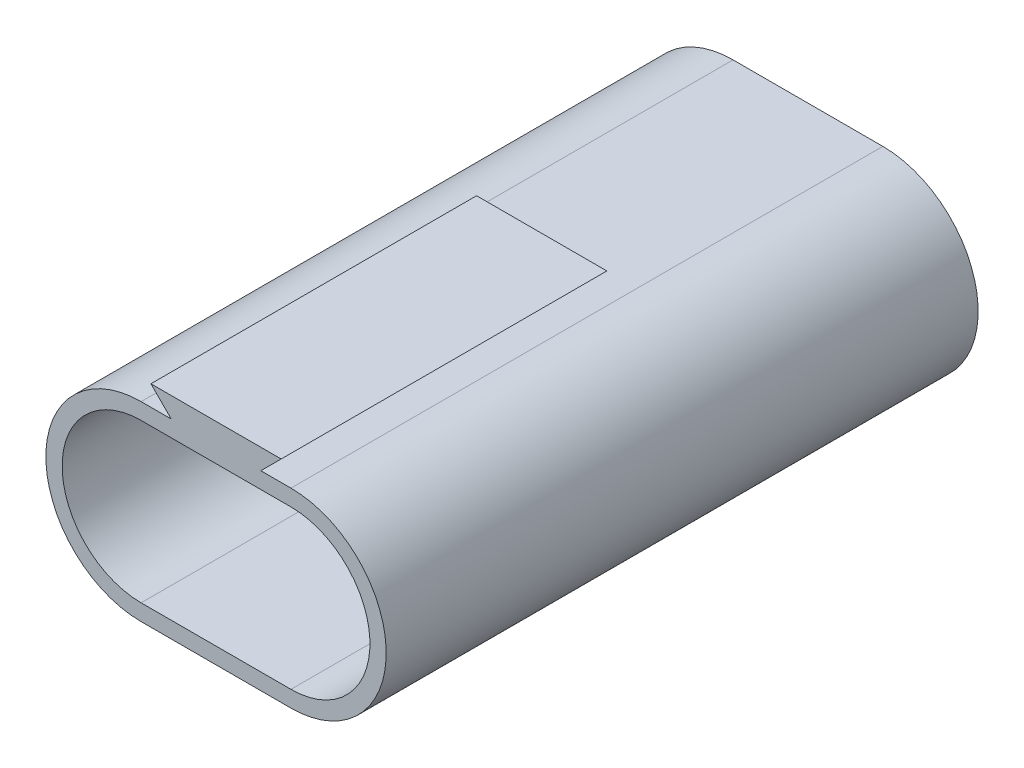
ISO-10303-21;
HEADER;
FILE_DESCRIPTION(('STEP AP214'),'2;1');
FILE_NAME('part.step','',(''),(''),'','','');
FILE_SCHEMA(('AUTOMOTIVE_DESIGN { 1 0 10303 214 1 1 1 1 }'));
ENDSEC;
DATA;
#1=APPLICATION_CONTEXT('core data for automotive mechanical design processes');
#2=APPLICATION_PROTOCOL_DEFINITION('international standard','automotive_design',2000,#1);
#3=PRODUCT_CONTEXT('',#1,'mechanical');
#4=PRODUCT('Part','Part','',(#3));
#5=PRODUCT_RELATED_PRODUCT_CATEGORY('part','',(#4));
#6=PRODUCT_DEFINITION_FORMATION('','',#4);
#7=PRODUCT_DEFINITION_CONTEXT('part definition',#1,'design');
#8=PRODUCT_DEFINITION('design','',#6,#7);
#9=PRODUCT_DEFINITION_SHAPE('','',#8);
#10=(LENGTH_UNIT() NAMED_UNIT(*) SI_UNIT(.MILLI.,.METRE.));
#11=(NAMED_UNIT(*) PLANE_ANGLE_UNIT() SI_UNIT($,.RADIAN.));
#12=(NAMED_UNIT(*) SI_UNIT($,.STERADIAN.) SOLID_ANGLE_UNIT());
#13=UNCERTAINTY_MEASURE_WITH_UNIT(LENGTH_MEASURE(1.E-05),#10,'distance_accuracy_value','');
#14=(GEOMETRIC_REPRESENTATION_CONTEXT(3) GLOBAL_UNCERTAINTY_ASSIGNED_CONTEXT((#13)) GLOBAL_UNIT_ASSIGNED_CONTEXT((#10,
#11,#12)) REPRESENTATION_CONTEXT('',''));
#15=CARTESIAN_POINT('',(0.,0.,0.));
#16=DIRECTION('',(0.,0.,1.));
#17=DIRECTION('',(1.,0.,0.));
#18=AXIS2_PLACEMENT_3D('',#15,#16,#17);
#19=CARTESIAN_POINT('',(0.,11.7,70.2));
#20=DIRECTION('',(0.,1.,0.));
#21=DIRECTION('',(0.,0.,1.));
#22=AXIS2_PLACEMENT_3D('',#19,#20,#21);
#23=PLANE('',#22);
#24=DIRECTION('',(1.,0.,0.));
#25=VECTOR('',#24,1.);
#26=CARTESIAN_POINT('',(0.,11.7,27.7));
#27=LINE('',#26,#25);
#28=CARTESIAN_POINT('',(3.7,11.7,27.7));
#29=VERTEX_POINT('',#28);
#30=CARTESIAN_POINT('',(14.7,11.7,27.7));
#31=VERTEX_POINT('',#30);
#32=EDGE_CURVE('E313',#29,#31,#27,.T.);
#33=ORIENTED_EDGE('',*,*,#32,.T.);
#34=DIRECTION('',(0.,0.,1.));
#35=VECTOR('',#34,1.);
#36=CARTESIAN_POINT('',(14.7,11.7,30.2));
#37=LINE('',#36,#35);
#38=CARTESIAN_POINT('',(14.7,11.7,70.2));
#39=VERTEX_POINT('',#38);
#40=EDGE_CURVE('E233',#31,#39,#37,.T.);
#41=ORIENTED_EDGE('',*,*,#40,.T.);
#42=DIRECTION('',(1.,0.,0.));
#43=VECTOR('',#42,1.);
#44=CARTESIAN_POINT('',(0.,11.7,70.2));
#45=LINE('',#44,#43);
#46=CARTESIAN_POINT('',(18.4,11.7,70.2));
#47=VERTEX_POINT('',#46);
#48=EDGE_CURVE('E272',#39,#47,#45,.T.);
#49=ORIENTED_EDGE('',*,*,#48,.T.);
#50=DIRECTION('',(0.,0.,-1.));
#51=VECTOR('',#50,1.);
#52=CARTESIAN_POINT('',(18.4,11.7,70.2));
#53=LINE('',#52,#51);
#54=CARTESIAN_POINT('',(18.4,11.7,-2.5));
#55=VERTEX_POINT('',#54);
#56=EDGE_CURVE('E300',#47,#55,#53,.T.);
#57=ORIENTED_EDGE('',*,*,#56,.T.);
#58=DIRECTION('',(1.,0.,0.));
#59=VECTOR('',#58,1.);
#60=CARTESIAN_POINT('',(0.,11.7,-2.5));
#61=LINE('',#60,#59);
#62=CARTESIAN_POINT('',(0.,11.7,-2.5));
#63=VERTEX_POINT('',#62);
#64=EDGE_CURVE('E243',#63,#55,#61,.T.);
#65=ORIENTED_EDGE('',*,*,#64,.F.);
#66=DIRECTION('',(0.,0.,-1.));
#67=VECTOR('',#66,1.);
#68=CARTESIAN_POINT('',(0.,11.7,70.2));
#69=LINE('',#68,#67);
#70=CARTESIAN_POINT('',(0.,11.7,70.2));
#71=VERTEX_POINT('',#70);
#72=EDGE_CURVE('E310',#71,#63,#69,.T.);
#73=ORIENTED_EDGE('',*,*,#72,.F.);
#74=CARTESIAN_POINT('',(3.7,11.7,70.2));
#75=VERTEX_POINT('',#74);
#76=EDGE_CURVE('E273',#71,#75,#45,.T.);
#77=ORIENTED_EDGE('',*,*,#76,.T.);
#78=DIRECTION('',(0.,0.,1.));
#79=VECTOR('',#78,1.);
#80=CARTESIAN_POINT('',(3.7,11.7,30.2));
#81=LINE('',#80,#79);
#82=EDGE_CURVE('E214',#29,#75,#81,.T.);
#83=ORIENTED_EDGE('',*,*,#82,.F.);
#84=EDGE_LOOP('',(#33,#41,#49,#57,#65,#73,#77,#83));
#85=FACE_BOUND('',#84,.T.);
#86=ADVANCED_FACE('F46',(#85),#23,.T.);
#87=CARTESIAN_POINT('',(0.,0.,70.2));
#88=DIRECTION('',(0.,0.,-1.));
#89=DIRECTION('',(-1.,0.,0.));
#90=AXIS2_PLACEMENT_3D('',#87,#88,#89);
#91=CYLINDRICAL_SURFACE('',#90,11.7);
#92=ORIENTED_EDGE('',*,*,#72,.T.);
#93=CARTESIAN_POINT('',(0.,0.,-2.5));
#94=DIRECTION('',(0.,0.,-1.));
#95=DIRECTION('',(-1.,0.,0.));
#96=AXIS2_PLACEMENT_3D('',#93,#94,#95);
#97=CIRCLE('',#96,11.7);
#98=CARTESIAN_POINT('',(0.,-11.7,-2.5));
#99=VERTEX_POINT('',#98);
#100=EDGE_CURVE('E229',#99,#63,#97,.T.);
#101=ORIENTED_EDGE('',*,*,#100,.F.);
#102=DIRECTION('',(0.,0.,-1.));
#103=VECTOR('',#102,1.);
#104=CARTESIAN_POINT('',(0.,-11.7,70.2));
#105=LINE('',#104,#103);
#106=CARTESIAN_POINT('',(0.,-11.7,70.2));
#107=VERTEX_POINT('',#106);
#108=EDGE_CURVE('E307',#107,#99,#105,.T.);
#109=ORIENTED_EDGE('',*,*,#108,.F.);
#110=CARTESIAN_POINT('',(0.,0.,70.2));
#111=DIRECTION('',(0.,0.,1.));
#112=DIRECTION('',(1.,0.,0.));
#113=AXIS2_PLACEMENT_3D('',#110,#111,#112);
#114=CIRCLE('',#113,11.7);
#115=EDGE_CURVE('E276',#71,#107,#114,.T.);
#116=ORIENTED_EDGE('',*,*,#115,.F.);
#117=EDGE_LOOP('',(#92,#101,#109,#116));
#118=FACE_BOUND('',#117,.T.);
#119=ADVANCED_FACE('F358',(#118),#91,.T.);
#120=CARTESIAN_POINT('',(0.,-11.7,70.2));
#121=DIRECTION('',(0.,1.,0.));
#122=DIRECTION('',(0.,0.,1.));
#123=AXIS2_PLACEMENT_3D('',#120,#121,#122);
#124=PLANE('',#123);
#125=ORIENTED_EDGE('',*,*,#108,.T.);
#126=DIRECTION('',(-1.,0.,0.));
#127=VECTOR('',#126,1.);
#128=CARTESIAN_POINT('',(18.4,-11.7,-2.5));
#129=LINE('',#128,#127);
#130=CARTESIAN_POINT('',(18.4,-11.7,-2.5));
#131=VERTEX_POINT('',#130);
#132=EDGE_CURVE('E251',#131,#99,#129,.T.);
#133=ORIENTED_EDGE('',*,*,#132,.F.);
#134=DIRECTION('',(0.,0.,-1.));
#135=VECTOR('',#134,1.);
#136=CARTESIAN_POINT('',(18.4,-11.7,70.2));
#137=LINE('',#136,#135);
#138=CARTESIAN_POINT('',(18.4,-11.7,70.2));
#139=VERTEX_POINT('',#138);
#140=EDGE_CURVE('E303',#139,#131,#137,.T.);
#141=ORIENTED_EDGE('',*,*,#140,.F.);
#142=DIRECTION('',(1.,0.,0.));
#143=VECTOR('',#142,1.);
#144=CARTESIAN_POINT('',(0.,-11.7,70.2));
#145=LINE('',#144,#143);
#146=EDGE_CURVE('E280',#107,#139,#145,.T.);
#147=ORIENTED_EDGE('',*,*,#146,.F.);
#148=EDGE_LOOP('',(#125,#133,#141,#147));
#149=FACE_BOUND('',#148,.T.);
#150=ADVANCED_FACE('F361',(#149),#124,.F.);
#151=CARTESIAN_POINT('',(0.,0.,70.2));
#152=DIRECTION('',(0.,0.,-1.));
#153=DIRECTION('',(-1.,0.,0.));
#154=AXIS2_PLACEMENT_3D('',#151,#152,#153);
#155=CYLINDRICAL_SURFACE('',#154,9.7);
#156=CARTESIAN_POINT('',(0.,0.,0.));
#157=DIRECTION('',(0.,0.,1.));
#158=DIRECTION('',(1.,0.,0.));
#159=AXIS2_PLACEMENT_3D('',#156,#157,#158);
#160=CIRCLE('',#159,9.7);
#161=CARTESIAN_POINT('',(0.,9.7,0.));
#162=VERTEX_POINT('',#161);
#163=CARTESIAN_POINT('',(0.,-9.7,0.));
#164=VERTEX_POINT('',#163);
#165=EDGE_CURVE('E255',#162,#164,#160,.T.);
#166=ORIENTED_EDGE('',*,*,#165,.F.);
#167=DIRECTION('',(0.,0.,-1.));
#168=VECTOR('',#167,1.);
#169=CARTESIAN_POINT('',(0.,9.7,70.2));
#170=LINE('',#169,#168);
#171=CARTESIAN_POINT('',(0.,9.7,70.2));
#172=VERTEX_POINT('',#171);
#173=EDGE_CURVE('E304',#172,#162,#170,.T.);
#174=ORIENTED_EDGE('',*,*,#173,.F.);
#175=CARTESIAN_POINT('',(0.,0.,70.2));
#176=DIRECTION('',(0.,0.,1.));
#177=DIRECTION('',(1.,0.,0.));
#178=AXIS2_PLACEMENT_3D('',#175,#176,#177);
#179=CIRCLE('',#178,9.7);
#180=CARTESIAN_POINT('',(0.,-9.7,70.2));
#181=VERTEX_POINT('',#180);
#182=EDGE_CURVE('E256',#172,#181,#179,.T.);
#183=ORIENTED_EDGE('',*,*,#182,.T.);
#184=DIRECTION('',(0.,0.,-1.));
#185=VECTOR('',#184,1.);
#186=CARTESIAN_POINT('',(0.,-9.7,70.2));
#187=LINE('',#186,#185);
#188=EDGE_CURVE('E288',#181,#164,#187,.T.);
#189=ORIENTED_EDGE('',*,*,#188,.T.);
#190=EDGE_LOOP('',(#166,#174,#183,#189));
#191=FACE_BOUND('',#190,.T.);
#192=ADVANCED_FACE('F394',(#191),#155,.F.);
#193=CARTESIAN_POINT('',(0.,9.7,70.2));
#194=DIRECTION('',(0.,1.,0.));
#195=DIRECTION('',(0.,0.,1.));
#196=AXIS2_PLACEMENT_3D('',#193,#194,#195);
#197=PLANE('',#196);
#198=DIRECTION('',(1.,0.,0.));
#199=VECTOR('',#198,1.);
#200=CARTESIAN_POINT('',(0.,9.7,0.));
#201=LINE('',#200,#199);
#202=CARTESIAN_POINT('',(18.4,9.7,0.));
#203=VERTEX_POINT('',#202);
#204=EDGE_CURVE('E291',#162,#203,#201,.T.);
#205=ORIENTED_EDGE('',*,*,#204,.T.);
#206=DIRECTION('',(0.,0.,-1.));
#207=VECTOR('',#206,1.);
#208=CARTESIAN_POINT('',(18.4,9.7,70.2));
#209=LINE('',#208,#207);
#210=CARTESIAN_POINT('',(18.4,9.7,70.2));
#211=VERTEX_POINT('',#210);
#212=EDGE_CURVE('E321',#211,#203,#209,.T.);
#213=ORIENTED_EDGE('',*,*,#212,.F.);
#214=DIRECTION('',(1.,0.,0.));
#215=VECTOR('',#214,1.);
#216=CARTESIAN_POINT('',(0.,9.7,70.2));
#217=LINE('',#216,#215);
#218=EDGE_CURVE('E260',#172,#211,#217,.T.);
#219=ORIENTED_EDGE('',*,*,#218,.F.);
#220=ORIENTED_EDGE('',*,*,#173,.T.);
#221=EDGE_LOOP('',(#205,#213,#219,#220));
#222=FACE_BOUND('',#221,.T.);
#223=ADVANCED_FACE('F391',(#222),#197,.F.);
#224=CARTESIAN_POINT('',(18.4,0.,70.2));
#225=DIRECTION('',(0.,0.,-1.));
#226=DIRECTION('',(-1.,0.,0.));
#227=AXIS2_PLACEMENT_3D('',#224,#225,#226);
#228=CYLINDRICAL_SURFACE('',#227,9.7);
#229=CARTESIAN_POINT('',(18.4,0.,0.));
#230=DIRECTION('',(0.,0.,1.));
#231=DIRECTION('',(1.,0.,0.));
#232=AXIS2_PLACEMENT_3D('',#229,#230,#231);
#233=CIRCLE('',#232,9.7);
#234=CARTESIAN_POINT('',(18.4,-9.7,0.));
#235=VERTEX_POINT('',#234);
#236=EDGE_CURVE('E295',#235,#203,#233,.T.);
#237=ORIENTED_EDGE('',*,*,#236,.F.);
#238=DIRECTION('',(0.,0.,-1.));
#239=VECTOR('',#238,1.);
#240=CARTESIAN_POINT('',(18.4,-9.7,70.2));
#241=LINE('',#240,#239);
#242=CARTESIAN_POINT('',(18.4,-9.7,70.2));
#243=VERTEX_POINT('',#242);
#244=EDGE_CURVE('E317',#243,#235,#241,.T.);
#245=ORIENTED_EDGE('',*,*,#244,.F.);
#246=CARTESIAN_POINT('',(18.4,0.,70.2));
#247=DIRECTION('',(0.,0.,1.));
#248=DIRECTION('',(1.,0.,0.));
#249=AXIS2_PLACEMENT_3D('',#246,#247,#248);
#250=CIRCLE('',#249,9.7);
#251=EDGE_CURVE('E264',#243,#211,#250,.T.);
#252=ORIENTED_EDGE('',*,*,#251,.T.);
#253=ORIENTED_EDGE('',*,*,#212,.T.);
#254=EDGE_LOOP('',(#237,#245,#252,#253));
#255=FACE_BOUND('',#254,.T.);
#256=ADVANCED_FACE('F376',(#255),#228,.F.);
#257=CARTESIAN_POINT('',(0.,-9.7,70.2));
#258=DIRECTION('',(0.,1.,0.));
#259=DIRECTION('',(0.,0.,1.));
#260=AXIS2_PLACEMENT_3D('',#257,#258,#259);
#261=PLANE('',#260);
#262=DIRECTION('',(1.,0.,0.));
#263=VECTOR('',#262,1.);
#264=CARTESIAN_POINT('',(0.,-9.7,0.));
#265=LINE('',#264,#263);
#266=EDGE_CURVE('E261',#164,#235,#265,.T.);
#267=ORIENTED_EDGE('',*,*,#266,.F.);
#268=ORIENTED_EDGE('',*,*,#188,.F.);
#269=DIRECTION('',(1.,0.,0.));
#270=VECTOR('',#269,1.);
#271=CARTESIAN_POINT('',(0.,-9.7,70.2));
#272=LINE('',#271,#270);
#273=EDGE_CURVE('E268',#181,#243,#272,.T.);
#274=ORIENTED_EDGE('',*,*,#273,.T.);
#275=ORIENTED_EDGE('',*,*,#244,.T.);
#276=EDGE_LOOP('',(#267,#268,#274,#275));
#277=FACE_BOUND('',#276,.T.);
#278=ADVANCED_FACE('F366',(#277),#261,.T.);
#279=CARTESIAN_POINT('',(18.4,0.,70.2));
#280=DIRECTION('',(0.,0.,-1.));
#281=DIRECTION('',(-1.,0.,0.));
#282=AXIS2_PLACEMENT_3D('',#279,#280,#281);
#283=CYLINDRICAL_SURFACE('',#282,11.7);
#284=ORIENTED_EDGE('',*,*,#140,.T.);
#285=CARTESIAN_POINT('',(18.4,0.,-2.5));
#286=DIRECTION('',(0.,0.,-1.));
#287=DIRECTION('',(-1.,0.,0.));
#288=AXIS2_PLACEMENT_3D('',#285,#286,#287);
#289=CIRCLE('',#288,11.7);
#290=EDGE_CURVE('E247',#55,#131,#289,.T.);
#291=ORIENTED_EDGE('',*,*,#290,.F.);
#292=ORIENTED_EDGE('',*,*,#56,.F.);
#293=CARTESIAN_POINT('',(18.4,0.,70.2));
#294=DIRECTION('',(0.,0.,1.));
#295=DIRECTION('',(1.,0.,0.));
#296=AXIS2_PLACEMENT_3D('',#293,#294,#295);
#297=CIRCLE('',#296,11.7);
#298=EDGE_CURVE('E284',#139,#47,#297,.T.);
#299=ORIENTED_EDGE('',*,*,#298,.F.);
#300=EDGE_LOOP('',(#284,#291,#292,#299));
#301=FACE_BOUND('',#300,.T.);
#302=ADVANCED_FACE('F364',(#301),#283,.T.);
#303=CARTESIAN_POINT('',(0.,0.,70.2));
#304=DIRECTION('',(0.,0.,1.));
#305=DIRECTION('',(1.,0.,0.));
#306=AXIS2_PLACEMENT_3D('',#303,#304,#305);
#307=PLANE('',#306);
#308=ORIENTED_EDGE('',*,*,#182,.F.);
#309=ORIENTED_EDGE('',*,*,#218,.T.);
#310=ORIENTED_EDGE('',*,*,#251,.F.);
#311=ORIENTED_EDGE('',*,*,#273,.F.);
#312=EDGE_LOOP('',(#308,#309,#310,#311));
#313=FACE_BOUND('',#312,.T.);
#314=ORIENTED_EDGE('',*,*,#76,.F.);
#315=ORIENTED_EDGE('',*,*,#115,.T.);
#316=ORIENTED_EDGE('',*,*,#146,.T.);
#317=ORIENTED_EDGE('',*,*,#298,.T.);
#318=ORIENTED_EDGE('',*,*,#48,.F.);
#319=DIRECTION('',(0.707106781186546,0.707106781186549,0.));
#320=VECTOR('',#319,1.);
#321=CARTESIAN_POINT('',(17.2,14.2,70.2));
#322=LINE('',#321,#320);
#323=CARTESIAN_POINT('',(17.2,14.2,70.2));
#324=VERTEX_POINT('',#323);
#325=EDGE_CURVE('E219',#39,#324,#322,.T.);
#326=ORIENTED_EDGE('',*,*,#325,.T.);
#327=DIRECTION('',(-1.,0.,0.));
#328=VECTOR('',#327,1.);
#329=CARTESIAN_POINT('',(1.2,14.2,70.2));
#330=LINE('',#329,#328);
#331=CARTESIAN_POINT('',(1.2,14.2,70.2));
#332=VERTEX_POINT('',#331);
#333=EDGE_CURVE('E215',#324,#332,#330,.T.);
#334=ORIENTED_EDGE('',*,*,#333,.T.);
#335=DIRECTION('',(0.707106781186546,-0.707106781186549,0.));
#336=VECTOR('',#335,1.);
#337=CARTESIAN_POINT('',(3.7,11.7,70.2));
#338=LINE('',#337,#336);
#339=EDGE_CURVE('E209',#332,#75,#338,.T.);
#340=ORIENTED_EDGE('',*,*,#339,.T.);
#341=EDGE_LOOP('',(#314,#315,#316,#317,#318,#326,#334,#340));
#342=FACE_BOUND('',#341,.T.);
#343=ADVANCED_FACE('F348',(#313,#342),#307,.T.);
#344=CARTESIAN_POINT('',(0.,0.,0.));
#345=DIRECTION('',(0.,0.,-1.));
#346=DIRECTION('',(-1.,0.,0.));
#347=AXIS2_PLACEMENT_3D('',#344,#345,#346);
#348=PLANE('',#347);
#349=DIRECTION('',(-1.,0.,0.));
#350=VECTOR('',#349,1.);
#351=CARTESIAN_POINT('',(0.,-3.,0.));
#352=LINE('',#351,#350);
#353=CARTESIAN_POINT('',(18.4,-3.,0.));
#354=VERTEX_POINT('',#353);
#355=CARTESIAN_POINT('',(0.,-3.,0.));
#356=VERTEX_POINT('',#355);
#357=EDGE_CURVE('E201',#354,#356,#352,.T.);
#358=ORIENTED_EDGE('',*,*,#357,.T.);
#359=CARTESIAN_POINT('',(0.,0.,0.));
#360=DIRECTION('',(0.,0.,-1.));
#361=DIRECTION('',(-1.,0.,0.));
#362=AXIS2_PLACEMENT_3D('',#359,#360,#361);
#363=CIRCLE('',#362,3.);
#364=CARTESIAN_POINT('',(0.,3.,0.));
#365=VERTEX_POINT('',#364);
#366=EDGE_CURVE('E205',#356,#365,#363,.T.);
#367=ORIENTED_EDGE('',*,*,#366,.T.);
#368=DIRECTION('',(1.,0.,0.));
#369=VECTOR('',#368,1.);
#370=CARTESIAN_POINT('',(0.,3.,0.));
#371=LINE('',#370,#369);
#372=CARTESIAN_POINT('',(18.4,3.,0.));
#373=VERTEX_POINT('',#372);
#374=EDGE_CURVE('E192',#365,#373,#371,.T.);
#375=ORIENTED_EDGE('',*,*,#374,.T.);
#376=CARTESIAN_POINT('',(18.4,0.,0.));
#377=DIRECTION('',(0.,0.,-1.));
#378=DIRECTION('',(-1.,0.,0.));
#379=AXIS2_PLACEMENT_3D('',#376,#377,#378);
#380=CIRCLE('',#379,3.);
#381=EDGE_CURVE('E167',#373,#354,#380,.T.);
#382=ORIENTED_EDGE('',*,*,#381,.T.);
#383=EDGE_LOOP('',(#358,#367,#375,#382));
#384=FACE_BOUND('',#383,.T.);
#385=ORIENTED_EDGE('',*,*,#204,.F.);
#386=ORIENTED_EDGE('',*,*,#165,.T.);
#387=ORIENTED_EDGE('',*,*,#266,.T.);
#388=ORIENTED_EDGE('',*,*,#236,.T.);
#389=EDGE_LOOP('',(#385,#386,#387,#388));
#390=FACE_BOUND('',#389,.T.);
#391=ADVANCED_FACE('F373',(#384,#390),#348,.F.);
#392=CARTESIAN_POINT('',(0.,0.,-2.5));
#393=DIRECTION('',(0.,0.,-1.));
#394=DIRECTION('',(-1.,0.,0.));
#395=AXIS2_PLACEMENT_3D('',#392,#393,#394);
#396=PLANE('',#395);
#397=CARTESIAN_POINT('',(0.,0.,-2.5));
#398=DIRECTION('',(0.,0.,-1.));
#399=DIRECTION('',(-1.,0.,0.));
#400=AXIS2_PLACEMENT_3D('',#397,#398,#399);
#401=CIRCLE('',#400,3.);
#402=CARTESIAN_POINT('',(0.,-3.,-2.5));
#403=VERTEX_POINT('',#402);
#404=CARTESIAN_POINT('',(0.,3.,-2.5));
#405=VERTEX_POINT('',#404);
#406=EDGE_CURVE('E71',#403,#405,#401,.T.);
#407=ORIENTED_EDGE('',*,*,#406,.F.);
#408=DIRECTION('',(-1.,0.,0.));
#409=VECTOR('',#408,1.);
#410=CARTESIAN_POINT('',(0.,-3.,-2.5));
#411=LINE('',#410,#409);
#412=CARTESIAN_POINT('',(18.4,-3.,-2.5));
#413=VERTEX_POINT('',#412);
#414=EDGE_CURVE('E182',#413,#403,#411,.T.);
#415=ORIENTED_EDGE('',*,*,#414,.F.);
#416=CARTESIAN_POINT('',(18.4,0.,-2.5));
#417=DIRECTION('',(0.,0.,-1.));
#418=DIRECTION('',(-1.,0.,0.));
#419=AXIS2_PLACEMENT_3D('',#416,#417,#418);
#420=CIRCLE('',#419,3.);
#421=CARTESIAN_POINT('',(18.4,3.,-2.5));
#422=VERTEX_POINT('',#421);
#423=EDGE_CURVE('E164',#422,#413,#420,.T.);
#424=ORIENTED_EDGE('',*,*,#423,.F.);
#425=DIRECTION('',(1.,0.,0.));
#426=VECTOR('',#425,1.);
#427=CARTESIAN_POINT('',(0.,3.,-2.5));
#428=LINE('',#427,#426);
#429=EDGE_CURVE('E174',#405,#422,#428,.T.);
#430=ORIENTED_EDGE('',*,*,#429,.F.);
#431=EDGE_LOOP('',(#407,#415,#424,#430));
#432=FACE_BOUND('',#431,.T.);
#433=ORIENTED_EDGE('',*,*,#100,.T.);
#434=ORIENTED_EDGE('',*,*,#64,.T.);
#435=ORIENTED_EDGE('',*,*,#290,.T.);
#436=ORIENTED_EDGE('',*,*,#132,.T.);
#437=EDGE_LOOP('',(#433,#434,#435,#436));
#438=FACE_BOUND('',#437,.T.);
#439=ADVANCED_FACE('F179',(#432,#438),#396,.T.);
#440=CARTESIAN_POINT('',(3.7,11.7,30.2));
#441=DIRECTION('',(-0.707106781186549,-0.707106781186546,0.));
#442=DIRECTION('',(0.707106781186546,-0.707106781186549,0.));
#443=AXIS2_PLACEMENT_3D('',#440,#441,#442);
#444=PLANE('',#443);
#445=ORIENTED_EDGE('',*,*,#339,.F.);
#446=DIRECTION('',(0.,0.,1.));
#447=VECTOR('',#446,1.);
#448=CARTESIAN_POINT('',(1.2,14.2,30.2));
#449=LINE('',#448,#447);
#450=CARTESIAN_POINT('',(1.2,14.2,30.2));
#451=VERTEX_POINT('',#450);
#452=EDGE_CURVE('E226',#451,#332,#449,.T.);
#453=ORIENTED_EDGE('',*,*,#452,.F.);
#454=DIRECTION('',(0.577350269189622,-0.577350269189625,-0.577350269189631));
#455=VECTOR('',#454,1.);
#456=CARTESIAN_POINT('',(2.46666666666669,12.9333333333333,28.9333333333333));
#457=LINE('',#456,#455);
#458=EDGE_CURVE('E11',#451,#29,#457,.T.);
#459=ORIENTED_EDGE('',*,*,#458,.T.);
#460=ORIENTED_EDGE('',*,*,#82,.T.);
#461=EDGE_LOOP('',(#445,#453,#459,#460));
#462=FACE_BOUND('',#461,.T.);
#463=ADVANCED_FACE('F345',(#462),#444,.T.);
#464=CARTESIAN_POINT('',(1.2,14.2,30.2));
#465=DIRECTION('',(0.,1.,0.));
#466=DIRECTION('',(0.,0.,1.));
#467=AXIS2_PLACEMENT_3D('',#464,#465,#466);
#468=PLANE('',#467);
#469=ORIENTED_EDGE('',*,*,#333,.F.);
#470=DIRECTION('',(0.,0.,1.));
#471=VECTOR('',#470,1.);
#472=CARTESIAN_POINT('',(17.2,14.2,30.2));
#473=LINE('',#472,#471);
#474=CARTESIAN_POINT('',(17.2,14.2,30.2));
#475=VERTEX_POINT('',#474);
#476=EDGE_CURVE('E230',#475,#324,#473,.T.);
#477=ORIENTED_EDGE('',*,*,#476,.F.);
#478=DIRECTION('',(-1.,0.,0.));
#479=VECTOR('',#478,1.);
#480=CARTESIAN_POINT('',(1.2,14.2,30.2));
#481=LINE('',#480,#479);
#482=EDGE_CURVE('E210',#475,#451,#481,.T.);
#483=ORIENTED_EDGE('',*,*,#482,.T.);
#484=ORIENTED_EDGE('',*,*,#452,.T.);
#485=EDGE_LOOP('',(#469,#477,#483,#484));
#486=FACE_BOUND('',#485,.T.);
#487=ADVANCED_FACE('F341',(#486),#468,.T.);
#488=CARTESIAN_POINT('',(17.2,14.2,30.2));
#489=DIRECTION('',(0.707106781186549,-0.707106781186546,0.));
#490=DIRECTION('',(0.707106781186546,0.707106781186549,0.));
#491=AXIS2_PLACEMENT_3D('',#488,#489,#490);
#492=PLANE('',#491);
#493=ORIENTED_EDGE('',*,*,#325,.F.);
#494=ORIENTED_EDGE('',*,*,#40,.F.);
#495=DIRECTION('',(0.577350269189622,0.577350269189625,0.577350269189631));
#496=VECTOR('',#495,1.);
#497=CARTESIAN_POINT('',(9.80000000000006,6.80000000000005,22.8));
#498=LINE('',#497,#496);
#499=EDGE_CURVE('E56',#31,#475,#498,.T.);
#500=ORIENTED_EDGE('',*,*,#499,.T.);
#501=ORIENTED_EDGE('',*,*,#476,.T.);
#502=EDGE_LOOP('',(#493,#494,#500,#501));
#503=FACE_BOUND('',#502,.T.);
#504=ADVANCED_FACE('F335',(#503),#492,.T.);
#505=CARTESIAN_POINT('',(0.,11.7,27.7));
#506=DIRECTION('',(0.,-0.707106781186551,0.707106781186544));
#507=DIRECTION('',(1.,0.,0.));
#508=AXIS2_PLACEMENT_3D('',#505,#506,#507);
#509=PLANE('',#508);
#510=ORIENTED_EDGE('',*,*,#458,.F.);
#511=ORIENTED_EDGE('',*,*,#482,.F.);
#512=ORIENTED_EDGE('',*,*,#499,.F.);
#513=ORIENTED_EDGE('',*,*,#32,.F.);
#514=EDGE_LOOP('',(#510,#511,#512,#513));
#515=FACE_BOUND('',#514,.T.);
#516=ADVANCED_FACE('F49',(#515),#509,.F.);
#517=CARTESIAN_POINT('',(0.,0.,7.5));
#518=DIRECTION('',(0.,0.,-1.));
#519=DIRECTION('',(-1.,0.,0.));
#520=AXIS2_PLACEMENT_3D('',#517,#518,#519);
#521=CYLINDRICAL_SURFACE('',#520,3.);
#522=DIRECTION('',(0.,0.,-1.));
#523=VECTOR('',#522,1.);
#524=CARTESIAN_POINT('',(0.,-3.,7.5));
#525=LINE('',#524,#523);
#526=EDGE_CURVE('E189',#356,#403,#525,.T.);
#527=ORIENTED_EDGE('',*,*,#526,.T.);
#528=ORIENTED_EDGE('',*,*,#406,.T.);
#529=DIRECTION('',(0.,0.,-1.));
#530=VECTOR('',#529,1.);
#531=CARTESIAN_POINT('',(0.,3.,7.5));
#532=LINE('',#531,#530);
#533=EDGE_CURVE('E171',#365,#405,#532,.T.);
#534=ORIENTED_EDGE('',*,*,#533,.F.);
#535=ORIENTED_EDGE('',*,*,#366,.F.);
#536=EDGE_LOOP('',(#527,#528,#534,#535));
#537=FACE_BOUND('',#536,.T.);
#538=ADVANCED_FACE('F423',(#537),#521,.F.);
#539=CARTESIAN_POINT('',(0.,-3.,7.5));
#540=DIRECTION('',(0.,-1.,0.));
#541=DIRECTION('',(1.,0.,0.));
#542=AXIS2_PLACEMENT_3D('',#539,#540,#541);
#543=PLANE('',#542);
#544=DIRECTION('',(0.,0.,-1.));
#545=VECTOR('',#544,1.);
#546=CARTESIAN_POINT('',(18.4,-3.,7.5));
#547=LINE('',#546,#545);
#548=EDGE_CURVE('E170',#354,#413,#547,.T.);
#549=ORIENTED_EDGE('',*,*,#548,.T.);
#550=ORIENTED_EDGE('',*,*,#414,.T.);
#551=ORIENTED_EDGE('',*,*,#526,.F.);
#552=ORIENTED_EDGE('',*,*,#357,.F.);
#553=EDGE_LOOP('',(#549,#550,#551,#552));
#554=FACE_BOUND('',#553,.T.);
#555=ADVANCED_FACE('F426',(#554),#543,.F.);
#556=CARTESIAN_POINT('',(18.4,0.,7.5));
#557=DIRECTION('',(0.,0.,-1.));
#558=DIRECTION('',(-1.,0.,0.));
#559=AXIS2_PLACEMENT_3D('',#556,#557,#558);
#560=CYLINDRICAL_SURFACE('',#559,3.);
#561=DIRECTION('',(0.,0.,-1.));
#562=VECTOR('',#561,1.);
#563=CARTESIAN_POINT('',(18.4,3.,7.5));
#564=LINE('',#563,#562);
#565=EDGE_CURVE('E63',#373,#422,#564,.T.);
#566=ORIENTED_EDGE('',*,*,#565,.T.);
#567=ORIENTED_EDGE('',*,*,#423,.T.);
#568=ORIENTED_EDGE('',*,*,#548,.F.);
#569=ORIENTED_EDGE('',*,*,#381,.F.);
#570=EDGE_LOOP('',(#566,#567,#568,#569));
#571=FACE_BOUND('',#570,.T.);
#572=ADVANCED_FACE('F161',(#571),#560,.F.);
#573=CARTESIAN_POINT('',(0.,3.,7.5));
#574=DIRECTION('',(0.,1.,0.));
#575=DIRECTION('',(-1.,0.,0.));
#576=AXIS2_PLACEMENT_3D('',#573,#574,#575);
#577=PLANE('',#576);
#578=ORIENTED_EDGE('',*,*,#533,.T.);
#579=ORIENTED_EDGE('',*,*,#429,.T.);
#580=ORIENTED_EDGE('',*,*,#565,.F.);
#581=ORIENTED_EDGE('',*,*,#374,.F.);
#582=EDGE_LOOP('',(#578,#579,#580,#581));
#583=FACE_BOUND('',#582,.T.);
#584=ADVANCED_FACE('F175',(#583),#577,.F.);
#585=CLOSED_SHELL('',(#86,#119,#150,#192,#223,#256,#278,#302,#343,#391,#439,#463,#487,#504,#516,
#538,#555,#572,#584));
#586=MANIFOLD_SOLID_BREP('B2',#585);
#587=ADVANCED_BREP_SHAPE_REPRESENTATION('',(#18,#586),#14);
#588=SHAPE_DEFINITION_REPRESENTATION(#9,#587);
ENDSEC;
END-ISO-10303-21;
